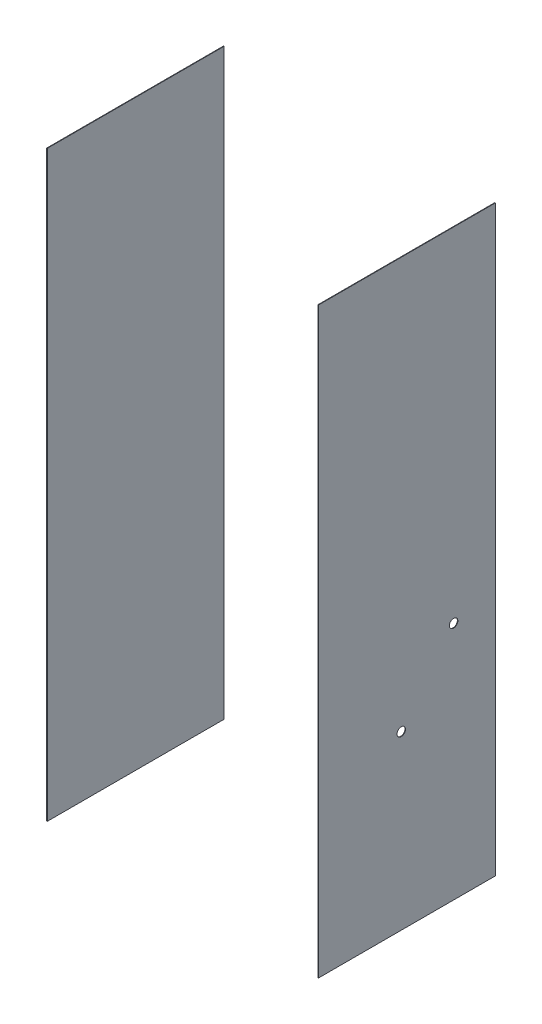
ISO-10303-21;
HEADER;
FILE_DESCRIPTION(('STEP AP214'),'2;1');
FILE_NAME('part.step','',(''),(''),'','','');
FILE_SCHEMA(('AUTOMOTIVE_DESIGN { 1 0 10303 214 1 1 1 1 }'));
ENDSEC;
DATA;
#1=APPLICATION_CONTEXT('core data for automotive mechanical design processes');
#2=APPLICATION_PROTOCOL_DEFINITION('international standard','automotive_design',2000,#1);
#3=PRODUCT_CONTEXT('',#1,'mechanical');
#4=PRODUCT('Part','Part','',(#3));
#5=PRODUCT_RELATED_PRODUCT_CATEGORY('part','',(#4));
#6=PRODUCT_DEFINITION_FORMATION('','',#4);
#7=PRODUCT_DEFINITION_CONTEXT('part definition',#1,'design');
#8=PRODUCT_DEFINITION('design','',#6,#7);
#9=PRODUCT_DEFINITION_SHAPE('','',#8);
#10=(LENGTH_UNIT() NAMED_UNIT(*) SI_UNIT(.MILLI.,.METRE.));
#11=(NAMED_UNIT(*) PLANE_ANGLE_UNIT() SI_UNIT($,.RADIAN.));
#12=(NAMED_UNIT(*) SI_UNIT($,.STERADIAN.) SOLID_ANGLE_UNIT());
#13=UNCERTAINTY_MEASURE_WITH_UNIT(LENGTH_MEASURE(1.E-05),#10,'distance_accuracy_value','');
#14=(GEOMETRIC_REPRESENTATION_CONTEXT(3) GLOBAL_UNCERTAINTY_ASSIGNED_CONTEXT((#13)) GLOBAL_UNIT_ASSIGNED_CONTEXT((#10,
#11,#12)) REPRESENTATION_CONTEXT('',''));
#15=CARTESIAN_POINT('',(0.,0.,0.));
#16=DIRECTION('',(0.,0.,1.));
#17=DIRECTION('',(1.,0.,0.));
#18=AXIS2_PLACEMENT_3D('',#15,#16,#17);
#19=CARTESIAN_POINT('',(-458.978,-984.25,-298.45));
#20=DIRECTION('',(0.,0.,1.));
#21=DIRECTION('',(-1.,0.,0.));
#22=AXIS2_PLACEMENT_3D('',#19,#20,#21);
#23=PLANE('',#22);
#24=DIRECTION('',(0.,1.,0.));
#25=VECTOR('',#24,1.);
#26=CARTESIAN_POINT('',(-457.2,-984.25,-298.45));
#27=LINE('',#26,#25);
#28=CARTESIAN_POINT('',(-457.2,-984.25,-298.45));
#29=VERTEX_POINT('',#28);
#30=CARTESIAN_POINT('',(-457.2,984.25,-298.45));
#31=VERTEX_POINT('',#30);
#32=EDGE_CURVE('E113',#29,#31,#27,.T.);
#33=ORIENTED_EDGE('',*,*,#32,.F.);
#34=DIRECTION('',(1.,0.,0.));
#35=VECTOR('',#34,1.);
#36=CARTESIAN_POINT('',(-458.978,-984.25,-298.45));
#37=LINE('',#36,#35);
#38=CARTESIAN_POINT('',(-458.978,-984.25,-298.45));
#39=VERTEX_POINT('',#38);
#40=EDGE_CURVE('E112',#39,#29,#37,.T.);
#41=ORIENTED_EDGE('',*,*,#40,.F.);
#42=DIRECTION('',(0.,1.,0.));
#43=VECTOR('',#42,1.);
#44=CARTESIAN_POINT('',(-458.978,-984.25,-298.45));
#45=LINE('',#44,#43);
#46=CARTESIAN_POINT('',(-458.978,984.25,-298.45));
#47=VERTEX_POINT('',#46);
#48=EDGE_CURVE('E107',#39,#47,#45,.T.);
#49=ORIENTED_EDGE('',*,*,#48,.T.);
#50=DIRECTION('',(1.,0.,0.));
#51=VECTOR('',#50,1.);
#52=CARTESIAN_POINT('',(-458.978,984.25,-298.45));
#53=LINE('',#52,#51);
#54=EDGE_CURVE('E12',#47,#31,#53,.T.);
#55=ORIENTED_EDGE('',*,*,#54,.T.);
#56=EDGE_LOOP('',(#33,#41,#49,#55));
#57=FACE_BOUND('',#56,.T.);
#58=ADVANCED_FACE('F50',(#57),#23,.F.);
#59=CARTESIAN_POINT('',(-458.978,984.25,-298.45));
#60=DIRECTION('',(0.,-1.,0.));
#61=DIRECTION('',(0.,0.,-1.));
#62=AXIS2_PLACEMENT_3D('',#59,#60,#61);
#63=PLANE('',#62);
#64=DIRECTION('',(0.,0.,1.));
#65=VECTOR('',#64,1.);
#66=CARTESIAN_POINT('',(-457.2,984.25,-298.45));
#67=LINE('',#66,#65);
#68=CARTESIAN_POINT('',(-457.2,984.25,298.45));
#69=VERTEX_POINT('',#68);
#70=EDGE_CURVE('E115',#31,#69,#67,.T.);
#71=ORIENTED_EDGE('',*,*,#70,.F.);
#72=ORIENTED_EDGE('',*,*,#54,.F.);
#73=DIRECTION('',(0.,0.,1.));
#74=VECTOR('',#73,1.);
#75=CARTESIAN_POINT('',(-458.978,984.25,-298.45));
#76=LINE('',#75,#74);
#77=CARTESIAN_POINT('',(-458.978,984.25,298.45));
#78=VERTEX_POINT('',#77);
#79=EDGE_CURVE('E91',#47,#78,#76,.T.);
#80=ORIENTED_EDGE('',*,*,#79,.T.);
#81=DIRECTION('',(1.,0.,0.));
#82=VECTOR('',#81,1.);
#83=CARTESIAN_POINT('',(-458.978,984.25,298.45));
#84=LINE('',#83,#82);
#85=EDGE_CURVE('E58',#78,#69,#84,.T.);
#86=ORIENTED_EDGE('',*,*,#85,.T.);
#87=EDGE_LOOP('',(#71,#72,#80,#86));
#88=FACE_BOUND('',#87,.T.);
#89=ADVANCED_FACE('F105',(#88),#63,.F.);
#90=CARTESIAN_POINT('',(-458.978,984.25,298.45));
#91=DIRECTION('',(0.,0.,-1.));
#92=DIRECTION('',(1.,0.,0.));
#93=AXIS2_PLACEMENT_3D('',#90,#91,#92);
#94=PLANE('',#93);
#95=DIRECTION('',(0.,-1.,0.));
#96=VECTOR('',#95,1.);
#97=CARTESIAN_POINT('',(-457.2,984.25,298.45));
#98=LINE('',#97,#96);
#99=CARTESIAN_POINT('',(-457.2,-984.25,298.45));
#100=VERTEX_POINT('',#99);
#101=EDGE_CURVE('E101',#69,#100,#98,.T.);
#102=ORIENTED_EDGE('',*,*,#101,.F.);
#103=ORIENTED_EDGE('',*,*,#85,.F.);
#104=DIRECTION('',(0.,-1.,0.));
#105=VECTOR('',#104,1.);
#106=CARTESIAN_POINT('',(-458.978,984.25,298.45));
#107=LINE('',#106,#105);
#108=CARTESIAN_POINT('',(-458.978,-984.25,298.45));
#109=VERTEX_POINT('',#108);
#110=EDGE_CURVE('E94',#78,#109,#107,.T.);
#111=ORIENTED_EDGE('',*,*,#110,.T.);
#112=DIRECTION('',(1.,0.,0.));
#113=VECTOR('',#112,1.);
#114=CARTESIAN_POINT('',(-458.978,-984.25,298.45));
#115=LINE('',#114,#113);
#116=EDGE_CURVE('E104',#109,#100,#115,.T.);
#117=ORIENTED_EDGE('',*,*,#116,.T.);
#118=EDGE_LOOP('',(#102,#103,#111,#117));
#119=FACE_BOUND('',#118,.T.);
#120=ADVANCED_FACE('F100',(#119),#94,.F.);
#121=CARTESIAN_POINT('',(-458.978,-984.25,298.45));
#122=DIRECTION('',(0.,1.,0.));
#123=DIRECTION('',(0.,0.,1.));
#124=AXIS2_PLACEMENT_3D('',#121,#122,#123);
#125=PLANE('',#124);
#126=DIRECTION('',(0.,0.,-1.));
#127=VECTOR('',#126,1.);
#128=CARTESIAN_POINT('',(-457.2,-984.25,298.45));
#129=LINE('',#128,#127);
#130=EDGE_CURVE('E80',#100,#29,#129,.T.);
#131=ORIENTED_EDGE('',*,*,#130,.F.);
#132=ORIENTED_EDGE('',*,*,#116,.F.);
#133=DIRECTION('',(0.,0.,-1.));
#134=VECTOR('',#133,1.);
#135=CARTESIAN_POINT('',(-458.978,-984.25,298.45));
#136=LINE('',#135,#134);
#137=EDGE_CURVE('E66',#109,#39,#136,.T.);
#138=ORIENTED_EDGE('',*,*,#137,.T.);
#139=ORIENTED_EDGE('',*,*,#40,.T.);
#140=EDGE_LOOP('',(#131,#132,#138,#139));
#141=FACE_BOUND('',#140,.T.);
#142=ADVANCED_FACE('F124',(#141),#125,.F.);
#143=CARTESIAN_POINT('',(-458.978,0.,0.));
#144=DIRECTION('',(-1.,0.,0.));
#145=DIRECTION('',(0.,0.,-1.));
#146=AXIS2_PLACEMENT_3D('',#143,#144,#145);
#147=PLANE('',#146);
#148=ORIENTED_EDGE('',*,*,#48,.F.);
#149=ORIENTED_EDGE('',*,*,#137,.F.);
#150=ORIENTED_EDGE('',*,*,#110,.F.);
#151=ORIENTED_EDGE('',*,*,#79,.F.);
#152=EDGE_LOOP('',(#148,#149,#150,#151));
#153=FACE_BOUND('',#152,.T.);
#154=ADVANCED_FACE('F96',(#153),#147,.T.);
#155=CARTESIAN_POINT('',(-457.2,0.,0.));
#156=DIRECTION('',(-1.,0.,0.));
#157=DIRECTION('',(0.,0.,-1.));
#158=AXIS2_PLACEMENT_3D('',#155,#156,#157);
#159=PLANE('',#158);
#160=ORIENTED_EDGE('',*,*,#32,.T.);
#161=ORIENTED_EDGE('',*,*,#70,.T.);
#162=ORIENTED_EDGE('',*,*,#101,.T.);
#163=ORIENTED_EDGE('',*,*,#130,.T.);
#164=EDGE_LOOP('',(#160,#161,#162,#163));
#165=FACE_BOUND('',#164,.T.);
#166=ADVANCED_FACE('F120',(#165),#159,.F.);
#167=CLOSED_SHELL('',(#58,#89,#120,#142,#154,#166));
#168=MANIFOLD_SOLID_BREP('B2',#167);
#169=CARTESIAN_POINT('',(458.978,-984.25,-298.45));
#170=DIRECTION('',(0.,0.,1.));
#171=DIRECTION('',(1.,0.,0.));
#172=AXIS2_PLACEMENT_3D('',#169,#170,#171);
#173=PLANE('',#172);
#174=DIRECTION('',(0.,1.,0.));
#175=VECTOR('',#174,1.);
#176=CARTESIAN_POINT('',(457.2,-984.25,-298.45));
#177=LINE('',#176,#175);
#178=CARTESIAN_POINT('',(457.2,-984.25,-298.45));
#179=VERTEX_POINT('',#178);
#180=CARTESIAN_POINT('',(457.2,984.25,-298.45));
#181=VERTEX_POINT('',#180);
#182=EDGE_CURVE('E250',#179,#181,#177,.T.);
#183=ORIENTED_EDGE('',*,*,#182,.T.);
#184=DIRECTION('',(-1.,0.,0.));
#185=VECTOR('',#184,1.);
#186=CARTESIAN_POINT('',(458.978,984.25,-298.45));
#187=LINE('',#186,#185);
#188=CARTESIAN_POINT('',(458.978,984.25,-298.45));
#189=VERTEX_POINT('',#188);
#190=EDGE_CURVE('E48',#189,#181,#187,.T.);
#191=ORIENTED_EDGE('',*,*,#190,.F.);
#192=DIRECTION('',(0.,1.,0.));
#193=VECTOR('',#192,1.);
#194=CARTESIAN_POINT('',(458.978,-984.25,-298.45));
#195=LINE('',#194,#193);
#196=CARTESIAN_POINT('',(458.978,-984.25,-298.45));
#197=VERTEX_POINT('',#196);
#198=EDGE_CURVE('E237',#197,#189,#195,.T.);
#199=ORIENTED_EDGE('',*,*,#198,.F.);
#200=DIRECTION('',(-1.,0.,0.));
#201=VECTOR('',#200,1.);
#202=CARTESIAN_POINT('',(458.978,-984.25,-298.45));
#203=LINE('',#202,#201);
#204=EDGE_CURVE('E246',#197,#179,#203,.T.);
#205=ORIENTED_EDGE('',*,*,#204,.T.);
#206=EDGE_LOOP('',(#183,#191,#199,#205));
#207=FACE_BOUND('',#206,.T.);
#208=ADVANCED_FACE('F184',(#207),#173,.F.);
#209=CARTESIAN_POINT('',(458.978,984.25,-298.45));
#210=DIRECTION('',(0.,-1.,0.));
#211=DIRECTION('',(0.,0.,-1.));
#212=AXIS2_PLACEMENT_3D('',#209,#210,#211);
#213=PLANE('',#212);
#214=DIRECTION('',(0.,0.,1.));
#215=VECTOR('',#214,1.);
#216=CARTESIAN_POINT('',(457.2,984.25,-298.45));
#217=LINE('',#216,#215);
#218=CARTESIAN_POINT('',(457.2,984.25,298.45));
#219=VERTEX_POINT('',#218);
#220=EDGE_CURVE('E241',#181,#219,#217,.T.);
#221=ORIENTED_EDGE('',*,*,#220,.T.);
#222=DIRECTION('',(-1.,0.,0.));
#223=VECTOR('',#222,1.);
#224=CARTESIAN_POINT('',(458.978,984.25,298.45));
#225=LINE('',#224,#223);
#226=CARTESIAN_POINT('',(458.978,984.25,298.45));
#227=VERTEX_POINT('',#226);
#228=EDGE_CURVE('E193',#227,#219,#225,.T.);
#229=ORIENTED_EDGE('',*,*,#228,.F.);
#230=DIRECTION('',(0.,0.,1.));
#231=VECTOR('',#230,1.);
#232=CARTESIAN_POINT('',(458.978,984.25,-298.45));
#233=LINE('',#232,#231);
#234=EDGE_CURVE('E232',#189,#227,#233,.T.);
#235=ORIENTED_EDGE('',*,*,#234,.F.);
#236=ORIENTED_EDGE('',*,*,#190,.T.);
#237=EDGE_LOOP('',(#221,#229,#235,#236));
#238=FACE_BOUND('',#237,.T.);
#239=ADVANCED_FACE('F240',(#238),#213,.F.);
#240=CARTESIAN_POINT('',(458.978,984.25,298.45));
#241=DIRECTION('',(0.,0.,-1.));
#242=DIRECTION('',(-1.,0.,0.));
#243=AXIS2_PLACEMENT_3D('',#240,#241,#242);
#244=PLANE('',#243);
#245=DIRECTION('',(0.,-1.,0.));
#246=VECTOR('',#245,1.);
#247=CARTESIAN_POINT('',(457.2,984.25,298.45));
#248=LINE('',#247,#246);
#249=CARTESIAN_POINT('',(457.2,-984.25,298.45));
#250=VERTEX_POINT('',#249);
#251=EDGE_CURVE('E219',#219,#250,#248,.T.);
#252=ORIENTED_EDGE('',*,*,#251,.T.);
#253=DIRECTION('',(-1.,0.,0.));
#254=VECTOR('',#253,1.);
#255=CARTESIAN_POINT('',(458.978,-984.25,298.45));
#256=LINE('',#255,#254);
#257=CARTESIAN_POINT('',(458.978,-984.25,298.45));
#258=VERTEX_POINT('',#257);
#259=EDGE_CURVE('E242',#258,#250,#256,.T.);
#260=ORIENTED_EDGE('',*,*,#259,.F.);
#261=DIRECTION('',(0.,-1.,0.));
#262=VECTOR('',#261,1.);
#263=CARTESIAN_POINT('',(458.978,984.25,298.45));
#264=LINE('',#263,#262);
#265=EDGE_CURVE('E235',#227,#258,#264,.T.);
#266=ORIENTED_EDGE('',*,*,#265,.F.);
#267=ORIENTED_EDGE('',*,*,#228,.T.);
#268=EDGE_LOOP('',(#252,#260,#266,#267));
#269=FACE_BOUND('',#268,.T.);
#270=ADVANCED_FACE('F244',(#269),#244,.F.);
#271=CARTESIAN_POINT('',(458.978,-984.25,298.45));
#272=DIRECTION('',(0.,1.,0.));
#273=DIRECTION('',(0.,0.,1.));
#274=AXIS2_PLACEMENT_3D('',#271,#272,#273);
#275=PLANE('',#274);
#276=DIRECTION('',(0.,0.,-1.));
#277=VECTOR('',#276,1.);
#278=CARTESIAN_POINT('',(457.2,-984.25,298.45));
#279=LINE('',#278,#277);
#280=EDGE_CURVE('E225',#250,#179,#279,.T.);
#281=ORIENTED_EDGE('',*,*,#280,.T.);
#282=ORIENTED_EDGE('',*,*,#204,.F.);
#283=DIRECTION('',(0.,0.,-1.));
#284=VECTOR('',#283,1.);
#285=CARTESIAN_POINT('',(458.978,-984.25,298.45));
#286=LINE('',#285,#284);
#287=EDGE_CURVE('E202',#258,#197,#286,.T.);
#288=ORIENTED_EDGE('',*,*,#287,.F.);
#289=ORIENTED_EDGE('',*,*,#259,.T.);
#290=EDGE_LOOP('',(#281,#282,#288,#289));
#291=FACE_BOUND('',#290,.T.);
#292=ADVANCED_FACE('F278',(#291),#275,.F.);
#293=CARTESIAN_POINT('',(458.978,0.,0.));
#294=DIRECTION('',(1.,0.,0.));
#295=DIRECTION('',(0.,0.,-1.));
#296=AXIS2_PLACEMENT_3D('',#293,#294,#295);
#297=PLANE('',#296);
#298=CARTESIAN_POINT('',(458.978,-403.46376,19.05));
#299=DIRECTION('',(1.,0.,0.));
#300=DIRECTION('',(0.,0.,-1.));
#301=AXIS2_PLACEMENT_3D('',#298,#299,#300);
#302=CIRCLE('',#301,14.2875);
#303=CARTESIAN_POINT('',(458.978,-403.46376,4.76249999999998));
#304=VERTEX_POINT('',#303);
#305=EDGE_CURVE('E267',#304,#304,#302,.T.);
#306=ORIENTED_EDGE('',*,*,#305,.F.);
#307=EDGE_LOOP('',(#306));
#308=FACE_BOUND('',#307,.T.);
#309=CARTESIAN_POINT('',(458.978,-174.68596,-157.734));
#310=DIRECTION('',(1.,0.,0.));
#311=DIRECTION('',(0.,0.,-1.));
#312=AXIS2_PLACEMENT_3D('',#309,#310,#311);
#313=CIRCLE('',#312,14.2875);
#314=CARTESIAN_POINT('',(458.978,-174.68596,-172.0215));
#315=VERTEX_POINT('',#314);
#316=EDGE_CURVE('E259',#315,#315,#313,.T.);
#317=ORIENTED_EDGE('',*,*,#316,.F.);
#318=EDGE_LOOP('',(#317));
#319=FACE_BOUND('',#318,.T.);
#320=ORIENTED_EDGE('',*,*,#198,.T.);
#321=ORIENTED_EDGE('',*,*,#234,.T.);
#322=ORIENTED_EDGE('',*,*,#265,.T.);
#323=ORIENTED_EDGE('',*,*,#287,.T.);
#324=EDGE_LOOP('',(#320,#321,#322,#323));
#325=FACE_BOUND('',#324,.T.);
#326=ADVANCED_FACE('F233',(#308,#319,#325),#297,.T.);
#327=CARTESIAN_POINT('',(457.2,0.,0.));
#328=DIRECTION('',(1.,0.,0.));
#329=DIRECTION('',(0.,0.,-1.));
#330=AXIS2_PLACEMENT_3D('',#327,#328,#329);
#331=PLANE('',#330);
#332=CARTESIAN_POINT('',(457.2,-403.46376,19.05));
#333=DIRECTION('',(1.,0.,0.));
#334=DIRECTION('',(0.,0.,-1.));
#335=AXIS2_PLACEMENT_3D('',#332,#333,#334);
#336=CIRCLE('',#335,14.2875);
#337=CARTESIAN_POINT('',(457.2,-403.46376,4.76249999999998));
#338=VERTEX_POINT('',#337);
#339=EDGE_CURVE('E187',#338,#338,#336,.T.);
#340=ORIENTED_EDGE('',*,*,#339,.T.);
#341=EDGE_LOOP('',(#340));
#342=FACE_BOUND('',#341,.T.);
#343=CARTESIAN_POINT('',(457.2,-174.68596,-157.734));
#344=DIRECTION('',(1.,0.,0.));
#345=DIRECTION('',(0.,0.,-1.));
#346=AXIS2_PLACEMENT_3D('',#343,#344,#345);
#347=CIRCLE('',#346,14.2875);
#348=CARTESIAN_POINT('',(457.2,-174.68596,-172.0215));
#349=VERTEX_POINT('',#348);
#350=EDGE_CURVE('E253',#349,#349,#347,.T.);
#351=ORIENTED_EDGE('',*,*,#350,.T.);
#352=EDGE_LOOP('',(#351));
#353=FACE_BOUND('',#352,.T.);
#354=ORIENTED_EDGE('',*,*,#182,.F.);
#355=ORIENTED_EDGE('',*,*,#280,.F.);
#356=ORIENTED_EDGE('',*,*,#251,.F.);
#357=ORIENTED_EDGE('',*,*,#220,.F.);
#358=EDGE_LOOP('',(#354,#355,#356,#357));
#359=FACE_BOUND('',#358,.T.);
#360=ADVANCED_FACE('F277',(#342,#353,#359),#331,.F.);
#361=CARTESIAN_POINT('',(456.438,-174.68596,-157.734));
#362=DIRECTION('',(1.,0.,0.));
#363=DIRECTION('',(0.,0.,-1.));
#364=AXIS2_PLACEMENT_3D('',#361,#362,#363);
#365=CYLINDRICAL_SURFACE('',#364,14.2875);
#366=ORIENTED_EDGE('',*,*,#316,.T.);
#367=EDGE_LOOP('',(#366));
#368=FACE_BOUND('',#367,.T.);
#369=ORIENTED_EDGE('',*,*,#350,.F.);
#370=EDGE_LOOP('',(#369));
#371=FACE_BOUND('',#370,.T.);
#372=ADVANCED_FACE('F284',(#368,#371),#365,.F.);
#373=CARTESIAN_POINT('',(456.438,-403.46376,19.05));
#374=DIRECTION('',(1.,0.,0.));
#375=DIRECTION('',(0.,0.,-1.));
#376=AXIS2_PLACEMENT_3D('',#373,#374,#375);
#377=CYLINDRICAL_SURFACE('',#376,14.2875);
#378=ORIENTED_EDGE('',*,*,#305,.T.);
#379=EDGE_LOOP('',(#378));
#380=FACE_BOUND('',#379,.T.);
#381=ORIENTED_EDGE('',*,*,#339,.F.);
#382=EDGE_LOOP('',(#381));
#383=FACE_BOUND('',#382,.T.);
#384=ADVANCED_FACE('F272',(#380,#383),#377,.F.);
#385=CLOSED_SHELL('',(#208,#239,#270,#292,#326,#360,#372,#384));
#386=MANIFOLD_SOLID_BREP('B6',#385);
#387=ADVANCED_BREP_SHAPE_REPRESENTATION('',(#18,#168,#386),#14);
#388=SHAPE_DEFINITION_REPRESENTATION(#9,#387);
ENDSEC;
END-ISO-10303-21;
